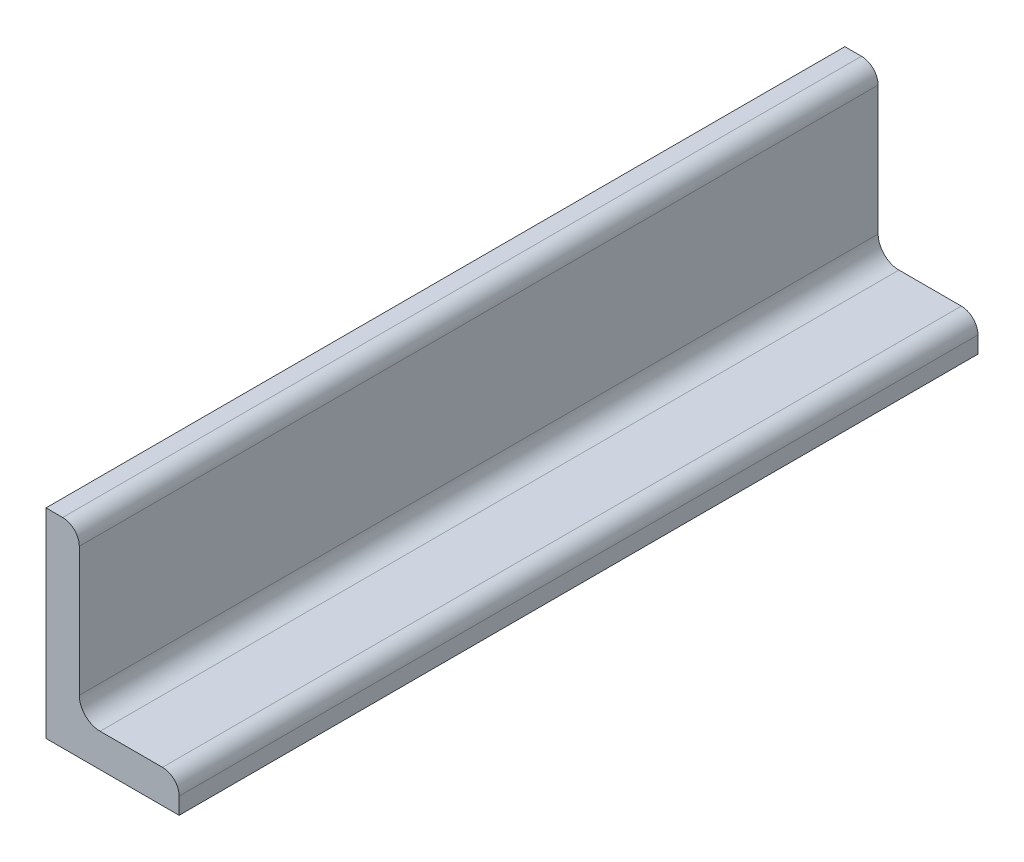
ISO-10303-21;
HEADER;
FILE_DESCRIPTION(('STEP AP214'),'2;1');
FILE_NAME('part.step','',(''),(''),'','','');
FILE_SCHEMA(('AUTOMOTIVE_DESIGN { 1 0 10303 214 1 1 1 1 }'));
ENDSEC;
DATA;
#1=APPLICATION_CONTEXT('core data for automotive mechanical design processes');
#2=APPLICATION_PROTOCOL_DEFINITION('international standard','automotive_design',2000,#1);
#3=PRODUCT_CONTEXT('',#1,'mechanical');
#4=PRODUCT('Part','Part','',(#3));
#5=PRODUCT_RELATED_PRODUCT_CATEGORY('part','',(#4));
#6=PRODUCT_DEFINITION_FORMATION('','',#4);
#7=PRODUCT_DEFINITION_CONTEXT('part definition',#1,'design');
#8=PRODUCT_DEFINITION('design','',#6,#7);
#9=PRODUCT_DEFINITION_SHAPE('','',#8);
#10=(LENGTH_UNIT() NAMED_UNIT(*) SI_UNIT(.MILLI.,.METRE.));
#11=(NAMED_UNIT(*) PLANE_ANGLE_UNIT() SI_UNIT($,.RADIAN.));
#12=(NAMED_UNIT(*) SI_UNIT($,.STERADIAN.) SOLID_ANGLE_UNIT());
#13=UNCERTAINTY_MEASURE_WITH_UNIT(LENGTH_MEASURE(1.E-05),#10,'distance_accuracy_value','');
#14=(GEOMETRIC_REPRESENTATION_CONTEXT(3) GLOBAL_UNCERTAINTY_ASSIGNED_CONTEXT((#13)) GLOBAL_UNIT_ASSIGNED_CONTEXT((#10,
#11,#12)) REPRESENTATION_CONTEXT('',''));
#15=CARTESIAN_POINT('',(0.,0.,0.));
#16=DIRECTION('',(0.,0.,1.));
#17=DIRECTION('',(1.,0.,0.));
#18=AXIS2_PLACEMENT_3D('',#15,#16,#17);
#19=CARTESIAN_POINT('',(0.116507760447575,76.2882459217981,304.8));
#20=DIRECTION('',(1.,0.,0.));
#21=DIRECTION('',(0.,0.,-1.));
#22=AXIS2_PLACEMENT_3D('',#19,#20,#21);
#23=PLANE('',#22);
#24=DIRECTION('',(0.,-1.,0.));
#25=VECTOR('',#24,1.);
#26=CARTESIAN_POINT('',(0.116507760447575,76.2882459217981,0.));
#27=LINE('',#26,#25);
#28=CARTESIAN_POINT('',(0.116507760447575,76.2882459217981,0.));
#29=VERTEX_POINT('',#28);
#30=CARTESIAN_POINT('',(0.116507760447575,0.0882459217980795,0.));
#31=VERTEX_POINT('',#30);
#32=EDGE_CURVE('E135',#29,#31,#27,.T.);
#33=ORIENTED_EDGE('',*,*,#32,.T.);
#34=DIRECTION('',(0.,0.,-1.));
#35=VECTOR('',#34,1.);
#36=CARTESIAN_POINT('',(0.116507760447575,0.0882459217980795,304.8));
#37=LINE('',#36,#35);
#38=CARTESIAN_POINT('',(0.116507760447575,0.0882459217980795,304.8));
#39=VERTEX_POINT('',#38);
#40=EDGE_CURVE('E11',#39,#31,#37,.T.);
#41=ORIENTED_EDGE('',*,*,#40,.F.);
#42=DIRECTION('',(0.,-1.,0.));
#43=VECTOR('',#42,1.);
#44=CARTESIAN_POINT('',(0.116507760447575,76.2882459217981,304.8));
#45=LINE('',#44,#43);
#46=CARTESIAN_POINT('',(0.116507760447575,76.2882459217981,304.8));
#47=VERTEX_POINT('',#46);
#48=EDGE_CURVE('E151',#47,#39,#45,.T.);
#49=ORIENTED_EDGE('',*,*,#48,.F.);
#50=DIRECTION('',(0.,0.,-1.));
#51=VECTOR('',#50,1.);
#52=CARTESIAN_POINT('',(0.116507760447575,76.2882459217981,304.8));
#53=LINE('',#52,#51);
#54=EDGE_CURVE('E131',#47,#29,#53,.T.);
#55=ORIENTED_EDGE('',*,*,#54,.T.);
#56=EDGE_LOOP('',(#33,#41,#49,#55));
#57=FACE_BOUND('',#56,.T.);
#58=ADVANCED_FACE('F33',(#57),#23,.F.);
#59=CARTESIAN_POINT('',(0.116507760447575,0.0882459217980795,304.8));
#60=DIRECTION('',(0.,1.,0.));
#61=DIRECTION('',(0.,0.,1.));
#62=AXIS2_PLACEMENT_3D('',#59,#60,#61);
#63=PLANE('',#62);
#64=DIRECTION('',(1.,0.,0.));
#65=VECTOR('',#64,1.);
#66=CARTESIAN_POINT('',(0.116507760447575,0.0882459217980795,0.));
#67=LINE('',#66,#65);
#68=CARTESIAN_POINT('',(50.9165077604476,0.0882459217980795,0.));
#69=VERTEX_POINT('',#68);
#70=EDGE_CURVE('E138',#31,#69,#67,.T.);
#71=ORIENTED_EDGE('',*,*,#70,.T.);
#72=DIRECTION('',(0.,0.,-1.));
#73=VECTOR('',#72,1.);
#74=CARTESIAN_POINT('',(50.9165077604476,0.0882459217980795,304.8));
#75=LINE('',#74,#73);
#76=CARTESIAN_POINT('',(50.9165077604476,0.0882459217980795,304.8));
#77=VERTEX_POINT('',#76);
#78=EDGE_CURVE('E41',#77,#69,#75,.T.);
#79=ORIENTED_EDGE('',*,*,#78,.F.);
#80=DIRECTION('',(1.,0.,0.));
#81=VECTOR('',#80,1.);
#82=CARTESIAN_POINT('',(0.116507760447575,0.0882459217980795,304.8));
#83=LINE('',#82,#81);
#84=EDGE_CURVE('E95',#39,#77,#83,.T.);
#85=ORIENTED_EDGE('',*,*,#84,.F.);
#86=ORIENTED_EDGE('',*,*,#40,.T.);
#87=EDGE_LOOP('',(#71,#79,#85,#86));
#88=FACE_BOUND('',#87,.T.);
#89=ADVANCED_FACE('F194',(#88),#63,.F.);
#90=CARTESIAN_POINT('',(50.9165077604476,0.0882459217980795,304.8));
#91=DIRECTION('',(-1.,0.,0.));
#92=DIRECTION('',(0.,0.,1.));
#93=AXIS2_PLACEMENT_3D('',#90,#91,#92);
#94=PLANE('',#93);
#95=DIRECTION('',(0.,1.,0.));
#96=VECTOR('',#95,1.);
#97=CARTESIAN_POINT('',(50.9165077604476,0.0882459217980795,0.));
#98=LINE('',#97,#96);
#99=CARTESIAN_POINT('',(50.9165077604476,6.43824592179808,0.));
#100=VERTEX_POINT('',#99);
#101=EDGE_CURVE('E140',#69,#100,#98,.T.);
#102=ORIENTED_EDGE('',*,*,#101,.T.);
#103=DIRECTION('',(0.,0.,-1.));
#104=VECTOR('',#103,1.);
#105=CARTESIAN_POINT('',(50.9165077604476,6.43824592179808,304.8));
#106=LINE('',#105,#104);
#107=CARTESIAN_POINT('',(50.9165077604476,6.43824592179808,304.8));
#108=VERTEX_POINT('',#107);
#109=EDGE_CURVE('E161',#108,#100,#106,.T.);
#110=ORIENTED_EDGE('',*,*,#109,.F.);
#111=DIRECTION('',(0.,1.,0.));
#112=VECTOR('',#111,1.);
#113=CARTESIAN_POINT('',(50.9165077604476,0.0882459217980795,304.8));
#114=LINE('',#113,#112);
#115=EDGE_CURVE('E169',#77,#108,#114,.T.);
#116=ORIENTED_EDGE('',*,*,#115,.F.);
#117=ORIENTED_EDGE('',*,*,#78,.T.);
#118=EDGE_LOOP('',(#102,#110,#116,#117));
#119=FACE_BOUND('',#118,.T.);
#120=ADVANCED_FACE('F167',(#119),#94,.F.);
#121=CARTESIAN_POINT('',(44.5665077604476,6.43824592179808,304.8));
#122=DIRECTION('',(0.,0.,-1.));
#123=DIRECTION('',(-1.,0.,0.));
#124=AXIS2_PLACEMENT_3D('',#121,#122,#123);
#125=CYLINDRICAL_SURFACE('',#124,6.35);
#126=CARTESIAN_POINT('',(44.5665077604476,6.43824592179808,0.));
#127=DIRECTION('',(0.,0.,1.));
#128=DIRECTION('',(1.,0.,0.));
#129=AXIS2_PLACEMENT_3D('',#126,#127,#128);
#130=CIRCLE('',#129,6.35);
#131=CARTESIAN_POINT('',(44.5665077604476,12.7882459217981,0.));
#132=VERTEX_POINT('',#131);
#133=EDGE_CURVE('E142',#100,#132,#130,.T.);
#134=ORIENTED_EDGE('',*,*,#133,.T.);
#135=DIRECTION('',(0.,0.,-1.));
#136=VECTOR('',#135,1.);
#137=CARTESIAN_POINT('',(44.5665077604476,12.7882459217981,304.8));
#138=LINE('',#137,#136);
#139=CARTESIAN_POINT('',(44.5665077604476,12.7882459217981,304.8));
#140=VERTEX_POINT('',#139);
#141=EDGE_CURVE('E158',#140,#132,#138,.T.);
#142=ORIENTED_EDGE('',*,*,#141,.F.);
#143=CARTESIAN_POINT('',(44.5665077604476,6.43824592179808,304.8));
#144=DIRECTION('',(0.,0.,1.));
#145=DIRECTION('',(1.,0.,0.));
#146=AXIS2_PLACEMENT_3D('',#143,#144,#145);
#147=CIRCLE('',#146,6.35);
#148=EDGE_CURVE('E185',#108,#140,#147,.T.);
#149=ORIENTED_EDGE('',*,*,#148,.F.);
#150=ORIENTED_EDGE('',*,*,#109,.T.);
#151=EDGE_LOOP('',(#134,#142,#149,#150));
#152=FACE_BOUND('',#151,.T.);
#153=ADVANCED_FACE('F178',(#152),#125,.T.);
#154=CARTESIAN_POINT('',(44.5665077604476,12.7882459217981,304.8));
#155=DIRECTION('',(0.,-1.,0.));
#156=DIRECTION('',(0.,0.,-1.));
#157=AXIS2_PLACEMENT_3D('',#154,#155,#156);
#158=PLANE('',#157);
#159=DIRECTION('',(-1.,0.,0.));
#160=VECTOR('',#159,1.);
#161=CARTESIAN_POINT('',(44.5665077604476,12.7882459217981,0.));
#162=LINE('',#161,#160);
#163=CARTESIAN_POINT('',(20.7540077604476,12.7882459217981,0.));
#164=VERTEX_POINT('',#163);
#165=EDGE_CURVE('E144',#132,#164,#162,.T.);
#166=ORIENTED_EDGE('',*,*,#165,.T.);
#167=DIRECTION('',(0.,0.,-1.));
#168=VECTOR('',#167,1.);
#169=CARTESIAN_POINT('',(20.7540077604476,12.7882459217981,304.8));
#170=LINE('',#169,#168);
#171=CARTESIAN_POINT('',(20.7540077604476,12.7882459217981,304.8));
#172=VERTEX_POINT('',#171);
#173=EDGE_CURVE('E155',#172,#164,#170,.T.);
#174=ORIENTED_EDGE('',*,*,#173,.F.);
#175=DIRECTION('',(-1.,0.,0.));
#176=VECTOR('',#175,1.);
#177=CARTESIAN_POINT('',(44.5665077604476,12.7882459217981,304.8));
#178=LINE('',#177,#176);
#179=EDGE_CURVE('E184',#140,#172,#178,.T.);
#180=ORIENTED_EDGE('',*,*,#179,.F.);
#181=ORIENTED_EDGE('',*,*,#141,.T.);
#182=EDGE_LOOP('',(#166,#174,#180,#181));
#183=FACE_BOUND('',#182,.T.);
#184=ADVANCED_FACE('F182',(#183),#158,.F.);
#185=CARTESIAN_POINT('',(20.7540077604476,20.7257459217981,304.8));
#186=DIRECTION('',(0.,0.,-1.));
#187=DIRECTION('',(-1.,0.,0.));
#188=AXIS2_PLACEMENT_3D('',#185,#186,#187);
#189=CYLINDRICAL_SURFACE('',#188,7.93749999999999);
#190=CARTESIAN_POINT('',(20.7540077604476,20.7257459217981,0.));
#191=DIRECTION('',(0.,0.,-1.));
#192=DIRECTION('',(1.,0.,0.));
#193=AXIS2_PLACEMENT_3D('',#190,#191,#192);
#194=CIRCLE('',#193,7.93749999999999);
#195=CARTESIAN_POINT('',(12.8165077604476,20.7257459217981,0.));
#196=VERTEX_POINT('',#195);
#197=EDGE_CURVE('E146',#164,#196,#194,.T.);
#198=ORIENTED_EDGE('',*,*,#197,.T.);
#199=DIRECTION('',(0.,0.,-1.));
#200=VECTOR('',#199,1.);
#201=CARTESIAN_POINT('',(12.8165077604476,20.7257459217981,304.8));
#202=LINE('',#201,#200);
#203=CARTESIAN_POINT('',(12.8165077604476,20.7257459217981,304.8));
#204=VERTEX_POINT('',#203);
#205=EDGE_CURVE('E126',#204,#196,#202,.T.);
#206=ORIENTED_EDGE('',*,*,#205,.F.);
#207=CARTESIAN_POINT('',(20.7540077604476,20.7257459217981,304.8));
#208=DIRECTION('',(0.,0.,-1.));
#209=DIRECTION('',(1.,0.,0.));
#210=AXIS2_PLACEMENT_3D('',#207,#208,#209);
#211=CIRCLE('',#210,7.93749999999999);
#212=EDGE_CURVE('E117',#172,#204,#211,.T.);
#213=ORIENTED_EDGE('',*,*,#212,.F.);
#214=ORIENTED_EDGE('',*,*,#173,.T.);
#215=EDGE_LOOP('',(#198,#206,#213,#214));
#216=FACE_BOUND('',#215,.T.);
#217=ADVANCED_FACE('F206',(#216),#189,.F.);
#218=CARTESIAN_POINT('',(12.8165077604476,20.7257459217981,304.8));
#219=DIRECTION('',(-1.,0.,0.));
#220=DIRECTION('',(0.,0.,1.));
#221=AXIS2_PLACEMENT_3D('',#218,#219,#220);
#222=PLANE('',#221);
#223=DIRECTION('',(0.,1.,0.));
#224=VECTOR('',#223,1.);
#225=CARTESIAN_POINT('',(12.8165077604476,20.7257459217981,0.));
#226=LINE('',#225,#224);
#227=CARTESIAN_POINT('',(12.8165077604476,69.9382459217981,0.));
#228=VERTEX_POINT('',#227);
#229=EDGE_CURVE('E125',#196,#228,#226,.T.);
#230=ORIENTED_EDGE('',*,*,#229,.T.);
#231=DIRECTION('',(0.,0.,-1.));
#232=VECTOR('',#231,1.);
#233=CARTESIAN_POINT('',(12.8165077604476,69.9382459217981,304.8));
#234=LINE('',#233,#232);
#235=CARTESIAN_POINT('',(12.8165077604476,69.9382459217981,304.8));
#236=VERTEX_POINT('',#235);
#237=EDGE_CURVE('E122',#236,#228,#234,.T.);
#238=ORIENTED_EDGE('',*,*,#237,.F.);
#239=DIRECTION('',(0.,1.,0.));
#240=VECTOR('',#239,1.);
#241=CARTESIAN_POINT('',(12.8165077604476,20.7257459217981,304.8));
#242=LINE('',#241,#240);
#243=EDGE_CURVE('E111',#204,#236,#242,.T.);
#244=ORIENTED_EDGE('',*,*,#243,.F.);
#245=ORIENTED_EDGE('',*,*,#205,.T.);
#246=EDGE_LOOP('',(#230,#238,#244,#245));
#247=FACE_BOUND('',#246,.T.);
#248=ADVANCED_FACE('F123',(#247),#222,.F.);
#249=CARTESIAN_POINT('',(6.46650776044757,69.9382459217981,304.8));
#250=DIRECTION('',(0.,0.,-1.));
#251=DIRECTION('',(-1.,0.,0.));
#252=AXIS2_PLACEMENT_3D('',#249,#250,#251);
#253=CYLINDRICAL_SURFACE('',#252,6.35);
#254=CARTESIAN_POINT('',(6.46650776044757,69.9382459217981,0.));
#255=DIRECTION('',(0.,0.,1.));
#256=DIRECTION('',(1.,0.,0.));
#257=AXIS2_PLACEMENT_3D('',#254,#255,#256);
#258=CIRCLE('',#257,6.35);
#259=CARTESIAN_POINT('',(6.46650776044757,76.2882459217981,0.));
#260=VERTEX_POINT('',#259);
#261=EDGE_CURVE('E81',#228,#260,#258,.T.);
#262=ORIENTED_EDGE('',*,*,#261,.T.);
#263=DIRECTION('',(0.,0.,-1.));
#264=VECTOR('',#263,1.);
#265=CARTESIAN_POINT('',(6.46650776044757,76.2882459217981,304.8));
#266=LINE('',#265,#264);
#267=CARTESIAN_POINT('',(6.46650776044757,76.2882459217981,304.8));
#268=VERTEX_POINT('',#267);
#269=EDGE_CURVE('E127',#268,#260,#266,.T.);
#270=ORIENTED_EDGE('',*,*,#269,.F.);
#271=CARTESIAN_POINT('',(6.46650776044757,69.9382459217981,304.8));
#272=DIRECTION('',(0.,0.,1.));
#273=DIRECTION('',(1.,0.,0.));
#274=AXIS2_PLACEMENT_3D('',#271,#272,#273);
#275=CIRCLE('',#274,6.35);
#276=EDGE_CURVE('E115',#236,#268,#275,.T.);
#277=ORIENTED_EDGE('',*,*,#276,.F.);
#278=ORIENTED_EDGE('',*,*,#237,.T.);
#279=EDGE_LOOP('',(#262,#270,#277,#278));
#280=FACE_BOUND('',#279,.T.);
#281=ADVANCED_FACE('F129',(#280),#253,.T.);
#282=CARTESIAN_POINT('',(6.46650776044757,76.2882459217981,304.8));
#283=DIRECTION('',(0.,-1.,0.));
#284=DIRECTION('',(0.,0.,-1.));
#285=AXIS2_PLACEMENT_3D('',#282,#283,#284);
#286=PLANE('',#285);
#287=DIRECTION('',(-1.,0.,0.));
#288=VECTOR('',#287,1.);
#289=CARTESIAN_POINT('',(6.46650776044757,76.2882459217981,0.));
#290=LINE('',#289,#288);
#291=EDGE_CURVE('E87',#260,#29,#290,.T.);
#292=ORIENTED_EDGE('',*,*,#291,.T.);
#293=ORIENTED_EDGE('',*,*,#54,.F.);
#294=DIRECTION('',(-1.,0.,0.));
#295=VECTOR('',#294,1.);
#296=CARTESIAN_POINT('',(6.46650776044757,76.2882459217981,304.8));
#297=LINE('',#296,#295);
#298=EDGE_CURVE('E49',#268,#47,#297,.T.);
#299=ORIENTED_EDGE('',*,*,#298,.F.);
#300=ORIENTED_EDGE('',*,*,#269,.T.);
#301=EDGE_LOOP('',(#292,#293,#299,#300));
#302=FACE_BOUND('',#301,.T.);
#303=ADVANCED_FACE('F214',(#302),#286,.F.);
#304=CARTESIAN_POINT('',(44.5665077604476,6.43824592179808,304.8));
#305=DIRECTION('',(0.,0.,1.));
#306=DIRECTION('',(1.,0.,0.));
#307=AXIS2_PLACEMENT_3D('',#304,#305,#306);
#308=PLANE('',#307);
#309=ORIENTED_EDGE('',*,*,#48,.T.);
#310=ORIENTED_EDGE('',*,*,#84,.T.);
#311=ORIENTED_EDGE('',*,*,#115,.T.);
#312=ORIENTED_EDGE('',*,*,#148,.T.);
#313=ORIENTED_EDGE('',*,*,#179,.T.);
#314=ORIENTED_EDGE('',*,*,#212,.T.);
#315=ORIENTED_EDGE('',*,*,#243,.T.);
#316=ORIENTED_EDGE('',*,*,#276,.T.);
#317=ORIENTED_EDGE('',*,*,#298,.T.);
#318=EDGE_LOOP('',(#309,#310,#311,#312,#313,#314,#315,#316,#317));
#319=FACE_BOUND('',#318,.T.);
#320=ADVANCED_FACE('F113',(#319),#308,.T.);
#321=CARTESIAN_POINT('',(44.5665077604476,6.43824592179808,0.));
#322=DIRECTION('',(0.,0.,1.));
#323=DIRECTION('',(1.,0.,0.));
#324=AXIS2_PLACEMENT_3D('',#321,#322,#323);
#325=PLANE('',#324);
#326=ORIENTED_EDGE('',*,*,#32,.F.);
#327=ORIENTED_EDGE('',*,*,#291,.F.);
#328=ORIENTED_EDGE('',*,*,#261,.F.);
#329=ORIENTED_EDGE('',*,*,#229,.F.);
#330=ORIENTED_EDGE('',*,*,#197,.F.);
#331=ORIENTED_EDGE('',*,*,#165,.F.);
#332=ORIENTED_EDGE('',*,*,#133,.F.);
#333=ORIENTED_EDGE('',*,*,#101,.F.);
#334=ORIENTED_EDGE('',*,*,#70,.F.);
#335=EDGE_LOOP('',(#326,#327,#328,#329,#330,#331,#332,#333,#334));
#336=FACE_BOUND('',#335,.T.);
#337=ADVANCED_FACE('F173',(#336),#325,.F.);
#338=CLOSED_SHELL('',(#58,#89,#120,#153,#184,#217,#248,#281,#303,#320,#337));
#339=MANIFOLD_SOLID_BREP('B2',#338);
#340=ADVANCED_BREP_SHAPE_REPRESENTATION('',(#18,#339),#14);
#341=SHAPE_DEFINITION_REPRESENTATION(#9,#340);
ENDSEC;
END-ISO-10303-21;
